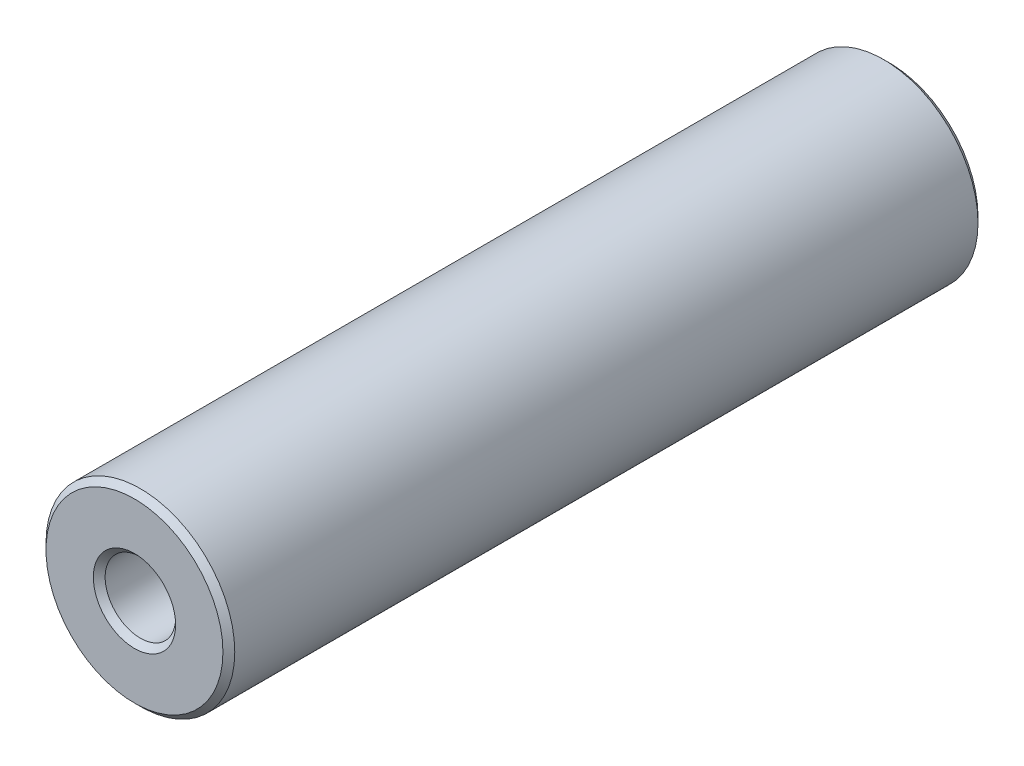
ISO-10303-21;
HEADER;
FILE_DESCRIPTION(('STEP AP214'),'2;1');
FILE_NAME('part.step','',(''),(''),'','','');
FILE_SCHEMA(('AUTOMOTIVE_DESIGN { 1 0 10303 214 1 1 1 1 }'));
ENDSEC;
DATA;
#1=APPLICATION_CONTEXT('core data for automotive mechanical design processes');
#2=APPLICATION_PROTOCOL_DEFINITION('international standard','automotive_design',2000,#1);
#3=PRODUCT_CONTEXT('',#1,'mechanical');
#4=PRODUCT('Part','Part','',(#3));
#5=PRODUCT_RELATED_PRODUCT_CATEGORY('part','',(#4));
#6=PRODUCT_DEFINITION_FORMATION('','',#4);
#7=PRODUCT_DEFINITION_CONTEXT('part definition',#1,'design');
#8=PRODUCT_DEFINITION('design','',#6,#7);
#9=PRODUCT_DEFINITION_SHAPE('','',#8);
#10=(LENGTH_UNIT() NAMED_UNIT(*) SI_UNIT(.MILLI.,.METRE.));
#11=(NAMED_UNIT(*) PLANE_ANGLE_UNIT() SI_UNIT($,.RADIAN.));
#12=(NAMED_UNIT(*) SI_UNIT($,.STERADIAN.) SOLID_ANGLE_UNIT());
#13=UNCERTAINTY_MEASURE_WITH_UNIT(LENGTH_MEASURE(1.E-05),#10,'distance_accuracy_value','');
#14=(GEOMETRIC_REPRESENTATION_CONTEXT(3) GLOBAL_UNCERTAINTY_ASSIGNED_CONTEXT((#13)) GLOBAL_UNIT_ASSIGNED_CONTEXT((#10,
#11,#12)) REPRESENTATION_CONTEXT('',''));
#15=CARTESIAN_POINT('',(0.,0.,0.));
#16=DIRECTION('',(0.,0.,1.));
#17=DIRECTION('',(1.,0.,0.));
#18=AXIS2_PLACEMENT_3D('',#15,#16,#17);
#19=CARTESIAN_POINT('',(0.,0.,-19.05));
#20=DIRECTION('',(0.,0.,1.));
#21=DIRECTION('',(1.,0.,0.));
#22=AXIS2_PLACEMENT_3D('',#19,#20,#21);
#23=CYLINDRICAL_SURFACE('',#22,4.7625);
#24=CARTESIAN_POINT('',(0.,0.,18.75155));
#25=DIRECTION('',(0.,0.,1.));
#26=DIRECTION('',(1.,0.,0.));
#27=AXIS2_PLACEMENT_3D('',#24,#25,#26);
#28=CIRCLE('',#27,4.7625);
#29=CARTESIAN_POINT('',(4.7625,0.,18.75155));
#30=VERTEX_POINT('',#29);
#31=EDGE_CURVE('E64',#30,#30,#28,.F.);
#32=CARTESIAN_POINT('',(0.,0.,-18.75155));
#33=DIRECTION('',(0.,0.,1.));
#34=DIRECTION('',(1.,0.,0.));
#35=AXIS2_PLACEMENT_3D('',#32,#33,#34);
#36=CIRCLE('',#35,4.7625);
#37=CARTESIAN_POINT('',(4.7625,0.,-18.75155));
#38=VERTEX_POINT('',#37);
#39=EDGE_CURVE('E68',#38,#38,#36,.T.);
#40=CARTESIAN_POINT('',(4.7625,0.,18.75155));
#41=CARTESIAN_POINT('',(4.7625,0.,18.3608927083333));
#42=CARTESIAN_POINT('',(4.7625,0.,17.9702354166667));
#43=CARTESIAN_POINT('',(4.7625,0.,17.1889208333333));
#44=CARTESIAN_POINT('',(4.7625,0.,16.7982635416667));
#45=CARTESIAN_POINT('',(4.7625,0.,16.0169489583333));
#46=CARTESIAN_POINT('',(4.7625,0.,15.6262916666667));
#47=CARTESIAN_POINT('',(4.7625,0.,14.8449770833333));
#48=CARTESIAN_POINT('',(4.7625,0.,14.4543197916667));
#49=CARTESIAN_POINT('',(4.7625,0.,13.6730052083333));
#50=CARTESIAN_POINT('',(4.7625,0.,13.2823479166667));
#51=CARTESIAN_POINT('',(4.7625,0.,12.5010333333333));
#52=CARTESIAN_POINT('',(4.7625,0.,12.1103760416667));
#53=CARTESIAN_POINT('',(4.7625,0.,11.3290614583333));
#54=CARTESIAN_POINT('',(4.7625,0.,10.9384041666667));
#55=CARTESIAN_POINT('',(4.7625,0.,10.1570895833333));
#56=CARTESIAN_POINT('',(4.7625,0.,9.76643229166667));
#57=CARTESIAN_POINT('',(4.7625,0.,8.98511770833334));
#58=CARTESIAN_POINT('',(4.7625,0.,8.59446041666667));
#59=CARTESIAN_POINT('',(4.7625,0.,7.81314583333333));
#60=CARTESIAN_POINT('',(4.7625,0.,7.42248854166667));
#61=CARTESIAN_POINT('',(4.7625,0.,6.64117395833334));
#62=CARTESIAN_POINT('',(4.7625,0.,6.25051666666667));
#63=CARTESIAN_POINT('',(4.7625,0.,5.46920208333334));
#64=CARTESIAN_POINT('',(4.7625,0.,5.07854479166667));
#65=CARTESIAN_POINT('',(4.7625,0.,4.29723020833334));
#66=CARTESIAN_POINT('',(4.7625,0.,3.90657291666667));
#67=CARTESIAN_POINT('',(4.7625,0.,3.12525833333334));
#68=CARTESIAN_POINT('',(4.7625,0.,2.73460104166667));
#69=CARTESIAN_POINT('',(4.7625,0.,1.95328645833334));
#70=CARTESIAN_POINT('',(4.7625,0.,1.56262916666667));
#71=CARTESIAN_POINT('',(4.7625,0.,0.781314583333337));
#72=CARTESIAN_POINT('',(4.7625,0.,0.39065729166667));
#73=CARTESIAN_POINT('',(4.7625,0.,-0.390657291666663));
#74=CARTESIAN_POINT('',(4.7625,0.,-0.78131458333333));
#75=CARTESIAN_POINT('',(4.7625,0.,-1.56262916666666));
#76=CARTESIAN_POINT('',(4.7625,0.,-1.95328645833333));
#77=CARTESIAN_POINT('',(4.7625,0.,-2.73460104166666));
#78=CARTESIAN_POINT('',(4.7625,0.,-3.12525833333333));
#79=CARTESIAN_POINT('',(4.7625,0.,-3.90657291666666));
#80=CARTESIAN_POINT('',(4.7625,0.,-4.29723020833333));
#81=CARTESIAN_POINT('',(4.7625,0.,-5.07854479166666));
#82=CARTESIAN_POINT('',(4.7625,0.,-5.46920208333333));
#83=CARTESIAN_POINT('',(4.7625,0.,-6.25051666666666));
#84=CARTESIAN_POINT('',(4.7625,0.,-6.64117395833333));
#85=CARTESIAN_POINT('',(4.7625,0.,-7.42248854166666));
#86=CARTESIAN_POINT('',(4.7625,0.,-7.81314583333333));
#87=CARTESIAN_POINT('',(4.7625,0.,-8.59446041666666));
#88=CARTESIAN_POINT('',(4.7625,0.,-8.98511770833333));
#89=CARTESIAN_POINT('',(4.7625,0.,-9.76643229166666));
#90=CARTESIAN_POINT('',(4.7625,0.,-10.1570895833333));
#91=CARTESIAN_POINT('',(4.7625,0.,-10.9384041666667));
#92=CARTESIAN_POINT('',(4.7625,0.,-11.3290614583333));
#93=CARTESIAN_POINT('',(4.7625,0.,-12.1103760416667));
#94=CARTESIAN_POINT('',(4.7625,0.,-12.5010333333333));
#95=CARTESIAN_POINT('',(4.7625,0.,-13.2823479166667));
#96=CARTESIAN_POINT('',(4.7625,0.,-13.6730052083333));
#97=CARTESIAN_POINT('',(4.7625,0.,-14.4543197916667));
#98=CARTESIAN_POINT('',(4.7625,0.,-14.8449770833333));
#99=CARTESIAN_POINT('',(4.7625,0.,-15.6262916666667));
#100=CARTESIAN_POINT('',(4.7625,0.,-16.0169489583333));
#101=CARTESIAN_POINT('',(4.7625,0.,-16.7982635416667));
#102=CARTESIAN_POINT('',(4.7625,0.,-17.1889208333333));
#103=CARTESIAN_POINT('',(4.7625,0.,-17.9702354166667));
#104=CARTESIAN_POINT('',(4.7625,0.,-18.3608927083333));
#105=CARTESIAN_POINT('',(4.7625,0.,-18.75155));
#106=B_SPLINE_CURVE_WITH_KNOTS('',3,(#40,#41,#42,#43,#44,#45,#46,#47,#48,#49,#50,#51,#52,#53,
#54,#55,#56,#57,#58,#59,#60,#61,#62,#63,#64,#65,#66,#67,#68,#69,#70,#71,#72,#73,#74,#75,#76,#77,
#78,#79,#80,#81,#82,#83,#84,#85,#86,#87,#88,#89,#90,#91,#92,#93,#94,#95,#96,#97,#98,#99,#100,
#101,#102,#103,#104,#105),.UNSPECIFIED.,.F.,.F.,(4,2,2,2,2,2,2,2,2,2,2,2,2,2,2,2,2,2,2,2,2,2,2,
2,2,2,2,2,2,2,2,2,4),(0.,1.171971875,2.34394375,3.515915625,4.6878875,5.859859375,7.03183125,
8.20380312499999,9.37577499999999,10.547746875,11.71971875,12.891690625,14.0636625,15.235634375,
16.40760625,17.579578125,18.75155,19.923521875,21.09549375,22.267465625,23.4394375,24.611409375,
25.78338125,26.955353125,28.127325,29.299296875,30.47126875,31.643240625,32.8152125,
33.987184375,35.15915625,36.331128125,37.5031),.UNSPECIFIED.);
#107=EDGE_CURVE('BSEAM39',#30,#38,#106,.T.);
#108=ORIENTED_EDGE('',*,*,#31,.T.);
#109=ORIENTED_EDGE('',*,*,#39,.T.);
#110=ORIENTED_EDGE('',*,*,#107,.T.);
#111=ORIENTED_EDGE('',*,*,#107,.F.);
#112=EDGE_LOOP('',(#108,#110,#109,#111));
#113=FACE_BOUND('',#112,.T.);
#114=ADVANCED_FACE('F39',(#113),#23,.T.);
#115=CARTESIAN_POINT('',(0.,0.,-19.05));
#116=DIRECTION('',(0.,0.,1.));
#117=DIRECTION('',(1.,0.,0.));
#118=AXIS2_PLACEMENT_3D('',#115,#116,#117);
#119=PLANE('',#118);
#120=CARTESIAN_POINT('',(0.,0.,-19.05));
#121=DIRECTION('',(0.,0.,1.));
#122=DIRECTION('',(1.,0.,0.));
#123=AXIS2_PLACEMENT_3D('',#120,#121,#122);
#124=CIRCLE('',#123,4.46404999999999);
#125=CARTESIAN_POINT('',(4.46404999999999,0.,-19.05));
#126=VERTEX_POINT('',#125);
#127=EDGE_CURVE('E53',#126,#126,#124,.F.);
#128=ORIENTED_EDGE('',*,*,#127,.T.);
#129=EDGE_LOOP('',(#128));
#130=FACE_BOUND('',#129,.T.);
#131=CARTESIAN_POINT('',(0.,0.,-19.05));
#132=DIRECTION('',(0.,0.,1.));
#133=DIRECTION('',(1.,0.,0.));
#134=AXIS2_PLACEMENT_3D('',#131,#132,#133);
#135=CIRCLE('',#134,2.07644999999998);
#136=CARTESIAN_POINT('',(2.07644999999998,0.,-19.05));
#137=VERTEX_POINT('',#136);
#138=EDGE_CURVE('E59',#137,#137,#135,.T.);
#139=ORIENTED_EDGE('',*,*,#138,.T.);
#140=EDGE_LOOP('',(#139));
#141=FACE_BOUND('',#140,.T.);
#142=ADVANCED_FACE('F95',(#130,#141),#119,.F.);
#143=CARTESIAN_POINT('',(0.,0.,-19.05));
#144=DIRECTION('',(0.,0.,1.));
#145=DIRECTION('',(1.,0.,0.));
#146=AXIS2_PLACEMENT_3D('',#143,#144,#145);
#147=CYLINDRICAL_SURFACE('',#146,1.778);
#148=CARTESIAN_POINT('',(0.,0.,18.75155));
#149=DIRECTION('',(0.,0.,1.));
#150=DIRECTION('',(1.,0.,0.));
#151=AXIS2_PLACEMENT_3D('',#148,#149,#150);
#152=CIRCLE('',#151,1.778);
#153=CARTESIAN_POINT('',(1.778,0.,18.75155));
#154=VERTEX_POINT('',#153);
#155=EDGE_CURVE('E10',#154,#154,#152,.T.);
#156=CARTESIAN_POINT('',(0.,0.,-18.75155));
#157=DIRECTION('',(0.,0.,1.));
#158=DIRECTION('',(1.,0.,0.));
#159=AXIS2_PLACEMENT_3D('',#156,#157,#158);
#160=CIRCLE('',#159,1.778);
#161=CARTESIAN_POINT('',(1.778,0.,-18.75155));
#162=VERTEX_POINT('',#161);
#163=EDGE_CURVE('E47',#162,#162,#160,.F.);
#164=CARTESIAN_POINT('',(1.778,0.,18.75155));
#165=CARTESIAN_POINT('',(1.778,0.,18.3608927083333));
#166=CARTESIAN_POINT('',(1.778,0.,17.9702354166666));
#167=CARTESIAN_POINT('',(1.778,0.,17.1889208333333));
#168=CARTESIAN_POINT('',(1.778,0.,16.7982635416666));
#169=CARTESIAN_POINT('',(1.778,0.,16.0169489583333));
#170=CARTESIAN_POINT('',(1.778,0.,15.6262916666666));
#171=CARTESIAN_POINT('',(1.778,0.,14.8449770833333));
#172=CARTESIAN_POINT('',(1.778,0.,14.4543197916666));
#173=CARTESIAN_POINT('',(1.778,0.,13.6730052083333));
#174=CARTESIAN_POINT('',(1.778,0.,13.2823479166666));
#175=CARTESIAN_POINT('',(1.778,0.,12.5010333333333));
#176=CARTESIAN_POINT('',(1.778,0.,12.1103760416666));
#177=CARTESIAN_POINT('',(1.778,0.,11.3290614583333));
#178=CARTESIAN_POINT('',(1.778,0.,10.9384041666666));
#179=CARTESIAN_POINT('',(1.778,0.,10.1570895833333));
#180=CARTESIAN_POINT('',(1.778,0.,9.76643229166663));
#181=CARTESIAN_POINT('',(1.778,0.,8.98511770833329));
#182=CARTESIAN_POINT('',(1.778,0.,8.59446041666663));
#183=CARTESIAN_POINT('',(1.778,0.,7.81314583333329));
#184=CARTESIAN_POINT('',(1.778,0.,7.42248854166663));
#185=CARTESIAN_POINT('',(1.778,0.,6.64117395833329));
#186=CARTESIAN_POINT('',(1.778,0.,6.25051666666663));
#187=CARTESIAN_POINT('',(1.778,0.,5.4692020833333));
#188=CARTESIAN_POINT('',(1.778,0.,5.07854479166663));
#189=CARTESIAN_POINT('',(1.778,0.,4.2972302083333));
#190=CARTESIAN_POINT('',(1.778,0.,3.90657291666663));
#191=CARTESIAN_POINT('',(1.778,0.,3.1252583333333));
#192=CARTESIAN_POINT('',(1.778,0.,2.73460104166663));
#193=CARTESIAN_POINT('',(1.778,0.,1.9532864583333));
#194=CARTESIAN_POINT('',(1.778,0.,1.56262916666663));
#195=CARTESIAN_POINT('',(1.778,0.,0.781314583333299));
#196=CARTESIAN_POINT('',(1.778,0.,0.390657291666632));
#197=CARTESIAN_POINT('',(1.778,0.,-0.390657291666701));
#198=CARTESIAN_POINT('',(1.778,0.,-0.781314583333368));
#199=CARTESIAN_POINT('',(1.778,0.,-1.5626291666667));
#200=CARTESIAN_POINT('',(1.778,0.,-1.95328645833337));
#201=CARTESIAN_POINT('',(1.778,0.,-2.7346010416667));
#202=CARTESIAN_POINT('',(1.778,0.,-3.12525833333337));
#203=CARTESIAN_POINT('',(1.778,0.,-3.9065729166667));
#204=CARTESIAN_POINT('',(1.778,0.,-4.29723020833336));
#205=CARTESIAN_POINT('',(1.778,0.,-5.0785447916667));
#206=CARTESIAN_POINT('',(1.778,0.,-5.46920208333337));
#207=CARTESIAN_POINT('',(1.778,0.,-6.2505166666667));
#208=CARTESIAN_POINT('',(1.778,0.,-6.64117395833336));
#209=CARTESIAN_POINT('',(1.778,0.,-7.4224885416667));
#210=CARTESIAN_POINT('',(1.778,0.,-7.81314583333336));
#211=CARTESIAN_POINT('',(1.778,0.,-8.5944604166667));
#212=CARTESIAN_POINT('',(1.778,0.,-8.98511770833336));
#213=CARTESIAN_POINT('',(1.778,0.,-9.7664322916667));
#214=CARTESIAN_POINT('',(1.778,0.,-10.1570895833334));
#215=CARTESIAN_POINT('',(1.778,0.,-10.9384041666667));
#216=CARTESIAN_POINT('',(1.778,0.,-11.3290614583334));
#217=CARTESIAN_POINT('',(1.778,0.,-12.1103760416667));
#218=CARTESIAN_POINT('',(1.778,0.,-12.5010333333334));
#219=CARTESIAN_POINT('',(1.778,0.,-13.2823479166667));
#220=CARTESIAN_POINT('',(1.778,0.,-13.6730052083334));
#221=CARTESIAN_POINT('',(1.778,0.,-14.4543197916667));
#222=CARTESIAN_POINT('',(1.778,0.,-14.8449770833334));
#223=CARTESIAN_POINT('',(1.778,0.,-15.6262916666667));
#224=CARTESIAN_POINT('',(1.778,0.,-16.0169489583334));
#225=CARTESIAN_POINT('',(1.778,0.,-16.7982635416667));
#226=CARTESIAN_POINT('',(1.778,0.,-17.1889208333334));
#227=CARTESIAN_POINT('',(1.778,0.,-17.9702354166667));
#228=CARTESIAN_POINT('',(1.778,0.,-18.3608927083334));
#229=CARTESIAN_POINT('',(1.778,0.,-18.75155));
#230=B_SPLINE_CURVE_WITH_KNOTS('',3,(#164,#165,#166,#167,#168,#169,#170,#171,#172,#173,#174,
#175,#176,#177,#178,#179,#180,#181,#182,#183,#184,#185,#186,#187,#188,#189,#190,#191,#192,#193,
#194,#195,#196,#197,#198,#199,#200,#201,#202,#203,#204,#205,#206,#207,#208,#209,#210,#211,#212,
#213,#214,#215,#216,#217,#218,#219,#220,#221,#222,#223,#224,#225,#226,#227,#228,#229),
.UNSPECIFIED.,.F.,.F.,(4,2,2,2,2,2,2,2,2,2,2,2,2,2,2,2,2,2,2,2,2,2,2,2,2,2,2,2,2,2,2,2,4),(0.,
1.171971875,2.34394375,3.515915625,4.6878875,5.859859375,7.03183124999999,8.20380312499999,
9.37577499999999,10.547746875,11.71971875,12.891690625,14.0636625,15.235634375,16.40760625,
17.579578125,18.75155,19.923521875,21.09549375,22.267465625,23.4394375,24.611409375,25.78338125,
26.955353125,28.127325,29.299296875,30.47126875,31.643240625,32.8152125,33.987184375,
35.15915625,36.331128125,37.5031),.UNSPECIFIED.);
#231=EDGE_CURVE('BSEAM101',#154,#162,#230,.T.);
#232=ORIENTED_EDGE('',*,*,#155,.T.);
#233=ORIENTED_EDGE('',*,*,#163,.T.);
#234=ORIENTED_EDGE('',*,*,#231,.T.);
#235=ORIENTED_EDGE('',*,*,#231,.F.);
#236=EDGE_LOOP('',(#232,#234,#233,#235));
#237=FACE_BOUND('',#236,.T.);
#238=ADVANCED_FACE('F101',(#237),#147,.F.);
#239=CARTESIAN_POINT('',(0.,0.,19.05));
#240=DIRECTION('',(0.,0.,1.));
#241=DIRECTION('',(1.,0.,0.));
#242=AXIS2_PLACEMENT_3D('',#239,#240,#241);
#243=PLANE('',#242);
#244=CARTESIAN_POINT('',(0.,0.,19.05));
#245=DIRECTION('',(0.,0.,1.));
#246=DIRECTION('',(1.,0.,0.));
#247=AXIS2_PLACEMENT_3D('',#244,#245,#246);
#248=CIRCLE('',#247,4.46405);
#249=CARTESIAN_POINT('',(4.46405,0.,19.05));
#250=VERTEX_POINT('',#249);
#251=EDGE_CURVE('E72',#250,#250,#248,.T.);
#252=ORIENTED_EDGE('',*,*,#251,.T.);
#253=EDGE_LOOP('',(#252));
#254=FACE_BOUND('',#253,.T.);
#255=CARTESIAN_POINT('',(0.,0.,19.05));
#256=DIRECTION('',(0.,0.,1.));
#257=DIRECTION('',(1.,0.,0.));
#258=AXIS2_PLACEMENT_3D('',#255,#256,#257);
#259=CIRCLE('',#258,2.07645000000005);
#260=CARTESIAN_POINT('',(2.07645000000005,0.,19.05));
#261=VERTEX_POINT('',#260);
#262=EDGE_CURVE('E76',#261,#261,#259,.F.);
#263=ORIENTED_EDGE('',*,*,#262,.T.);
#264=EDGE_LOOP('',(#263));
#265=FACE_BOUND('',#264,.T.);
#266=ADVANCED_FACE('F80',(#254,#265),#243,.T.);
#267=CARTESIAN_POINT('',(0.,0.,19.05));
#268=DIRECTION('',(0.,0.,-1.));
#269=DIRECTION('',(-1.,0.,0.));
#270=AXIS2_PLACEMENT_3D('',#267,#268,#269);
#271=CONICAL_SURFACE('',#270,4.46405,0.785398163397445);
#272=ORIENTED_EDGE('',*,*,#31,.F.);
#273=EDGE_LOOP('',(#272));
#274=FACE_BOUND('',#273,.T.);
#275=ORIENTED_EDGE('',*,*,#251,.F.);
#276=EDGE_LOOP('',(#275));
#277=FACE_BOUND('',#276,.T.);
#278=ADVANCED_FACE('F91',(#274,#277),#271,.T.);
#279=CARTESIAN_POINT('',(0.,0.,-18.75155));
#280=DIRECTION('',(0.,0.,1.));
#281=DIRECTION('',(1.,0.,0.));
#282=AXIS2_PLACEMENT_3D('',#279,#280,#281);
#283=CONICAL_SURFACE('',#282,4.7625,0.785398163397445);
#284=ORIENTED_EDGE('',*,*,#127,.F.);
#285=EDGE_LOOP('',(#284));
#286=FACE_BOUND('',#285,.T.);
#287=ORIENTED_EDGE('',*,*,#39,.F.);
#288=EDGE_LOOP('',(#287));
#289=FACE_BOUND('',#288,.T.);
#290=ADVANCED_FACE('F85',(#286,#289),#283,.T.);
#291=CARTESIAN_POINT('',(0.,0.,18.75155));
#292=DIRECTION('',(0.,0.,1.));
#293=DIRECTION('',(1.,0.,0.));
#294=AXIS2_PLACEMENT_3D('',#291,#292,#293);
#295=CONICAL_SURFACE('',#294,1.778,0.785398163397457);
#296=ORIENTED_EDGE('',*,*,#262,.F.);
#297=EDGE_LOOP('',(#296));
#298=FACE_BOUND('',#297,.T.);
#299=ORIENTED_EDGE('',*,*,#155,.F.);
#300=EDGE_LOOP('',(#299));
#301=FACE_BOUND('',#300,.T.);
#302=ADVANCED_FACE('F82',(#298,#301),#295,.F.);
#303=CARTESIAN_POINT('',(0.,0.,-19.05));
#304=DIRECTION('',(0.,0.,-1.));
#305=DIRECTION('',(-1.,0.,0.));
#306=AXIS2_PLACEMENT_3D('',#303,#304,#305);
#307=CONICAL_SURFACE('',#306,2.07644999999998,0.785398163397445);
#308=ORIENTED_EDGE('',*,*,#163,.F.);
#309=EDGE_LOOP('',(#308));
#310=FACE_BOUND('',#309,.T.);
#311=ORIENTED_EDGE('',*,*,#138,.F.);
#312=EDGE_LOOP('',(#311));
#313=FACE_BOUND('',#312,.T.);
#314=ADVANCED_FACE('F41',(#310,#313),#307,.F.);
#315=CLOSED_SHELL('',(#114,#142,#238,#266,#278,#290,#302,#314));
#316=MANIFOLD_SOLID_BREP('B2',#315);
#317=ADVANCED_BREP_SHAPE_REPRESENTATION('',(#18,#316),#14);
#318=SHAPE_DEFINITION_REPRESENTATION(#9,#317);
ENDSEC;
END-ISO-10303-21;
